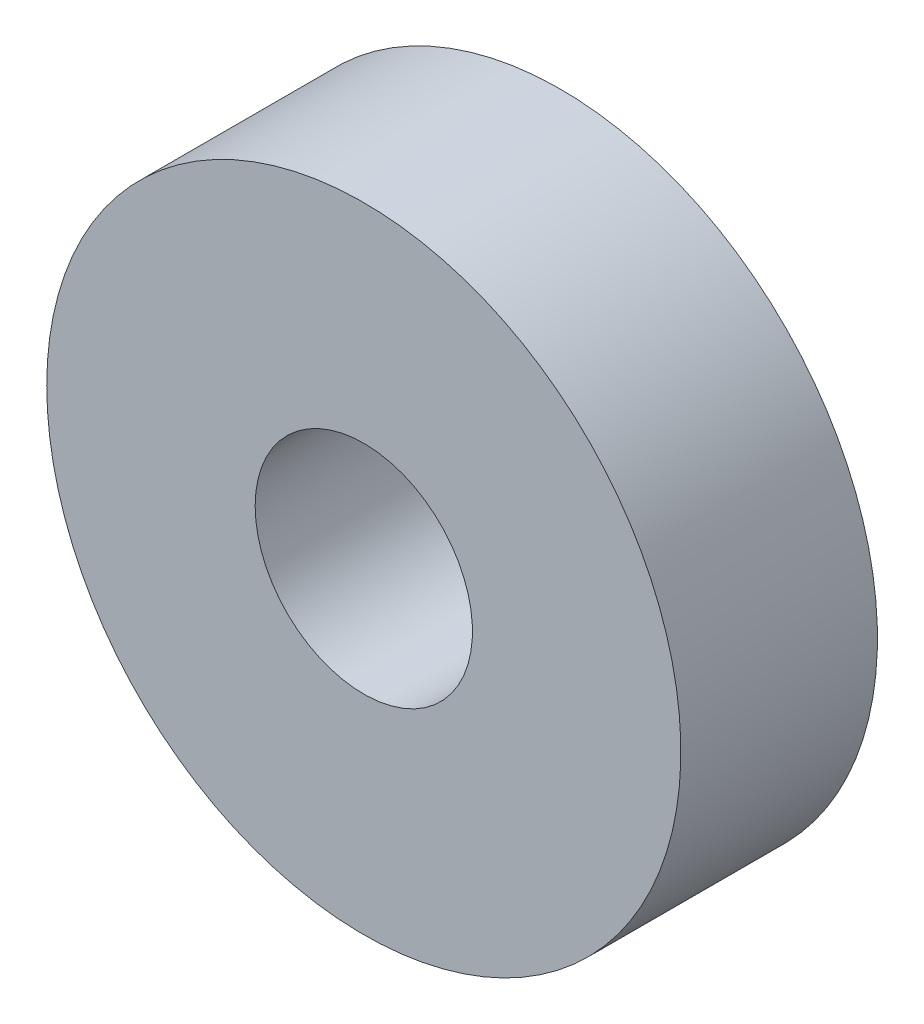
ISO-10303-21;
HEADER;
FILE_DESCRIPTION(('STEP AP214'),'2;1');
FILE_NAME('part.step','',(''),(''),'','','');
FILE_SCHEMA(('AUTOMOTIVE_DESIGN { 1 0 10303 214 1 1 1 1 }'));
ENDSEC;
DATA;
#1=APPLICATION_CONTEXT('core data for automotive mechanical design processes');
#2=APPLICATION_PROTOCOL_DEFINITION('international standard','automotive_design',2000,#1);
#3=PRODUCT_CONTEXT('',#1,'mechanical');
#4=PRODUCT('Part','Part','',(#3));
#5=PRODUCT_RELATED_PRODUCT_CATEGORY('part','',(#4));
#6=PRODUCT_DEFINITION_FORMATION('','',#4);
#7=PRODUCT_DEFINITION_CONTEXT('part definition',#1,'design');
#8=PRODUCT_DEFINITION('design','',#6,#7);
#9=PRODUCT_DEFINITION_SHAPE('','',#8);
#10=(LENGTH_UNIT() NAMED_UNIT(*) SI_UNIT(.MILLI.,.METRE.));
#11=(NAMED_UNIT(*) PLANE_ANGLE_UNIT() SI_UNIT($,.RADIAN.));
#12=(NAMED_UNIT(*) SI_UNIT($,.STERADIAN.) SOLID_ANGLE_UNIT());
#13=UNCERTAINTY_MEASURE_WITH_UNIT(LENGTH_MEASURE(1.E-05),#10,'distance_accuracy_value','');
#14=(GEOMETRIC_REPRESENTATION_CONTEXT(3) GLOBAL_UNCERTAINTY_ASSIGNED_CONTEXT((#13)) GLOBAL_UNIT_ASSIGNED_CONTEXT((#10,
#11,#12)) REPRESENTATION_CONTEXT('',''));
#15=CARTESIAN_POINT('',(0.,0.,0.));
#16=DIRECTION('',(0.,0.,1.));
#17=DIRECTION('',(1.,0.,0.));
#18=AXIS2_PLACEMENT_3D('',#15,#16,#17);
#19=CARTESIAN_POINT('',(0.,0.,-21.7308816762368));
#20=DIRECTION('',(0.,0.,-1.));
#21=DIRECTION('',(-1.,0.,0.));
#22=AXIS2_PLACEMENT_3D('',#19,#20,#21);
#23=CYLINDRICAL_SURFACE('',#22,9.525);
#24=CARTESIAN_POINT('',(0.,0.,2.95275));
#25=DIRECTION('',(0.,0.,-1.));
#26=DIRECTION('',(-1.,0.,0.));
#27=AXIS2_PLACEMENT_3D('',#24,#25,#26);
#28=CIRCLE('',#27,9.525);
#29=CARTESIAN_POINT('',(-9.525,0.,2.95275));
#30=VERTEX_POINT('',#29);
#31=EDGE_CURVE('E46',#30,#30,#28,.T.);
#32=ORIENTED_EDGE('',*,*,#31,.T.);
#33=EDGE_LOOP('',(#32));
#34=FACE_BOUND('',#33,.T.);
#35=CARTESIAN_POINT('',(0.,0.,-2.95275));
#36=DIRECTION('',(0.,0.,-1.));
#37=DIRECTION('',(-1.,0.,0.));
#38=AXIS2_PLACEMENT_3D('',#35,#36,#37);
#39=CIRCLE('',#38,9.525);
#40=CARTESIAN_POINT('',(-9.525,0.,-2.95275));
#41=VERTEX_POINT('',#40);
#42=EDGE_CURVE('E10',#41,#41,#39,.T.);
#43=ORIENTED_EDGE('',*,*,#42,.F.);
#44=EDGE_LOOP('',(#43));
#45=FACE_BOUND('',#44,.T.);
#46=ADVANCED_FACE('F32',(#34,#45),#23,.T.);
#47=CARTESIAN_POINT('',(0.,9.525,-2.95275));
#48=DIRECTION('',(0.,0.,-1.));
#49=DIRECTION('',(-1.,0.,0.));
#50=AXIS2_PLACEMENT_3D('',#47,#48,#49);
#51=PLANE('',#50);
#52=ORIENTED_EDGE('',*,*,#42,.T.);
#53=EDGE_LOOP('',(#52));
#54=FACE_BOUND('',#53,.T.);
#55=CARTESIAN_POINT('',(0.,0.,-2.95275));
#56=DIRECTION('',(0.,0.,-1.));
#57=DIRECTION('',(-1.,0.,0.));
#58=AXIS2_PLACEMENT_3D('',#55,#56,#57);
#59=CIRCLE('',#58,3.2639);
#60=CARTESIAN_POINT('',(-3.2639,0.,-2.95275));
#61=VERTEX_POINT('',#60);
#62=EDGE_CURVE('E38',#61,#61,#59,.T.);
#63=ORIENTED_EDGE('',*,*,#62,.F.);
#64=EDGE_LOOP('',(#63));
#65=FACE_BOUND('',#64,.T.);
#66=ADVANCED_FACE('F62',(#54,#65),#51,.T.);
#67=CARTESIAN_POINT('',(0.,0.,-21.7308816762368));
#68=DIRECTION('',(0.,0.,-1.));
#69=DIRECTION('',(-1.,0.,0.));
#70=AXIS2_PLACEMENT_3D('',#67,#68,#69);
#71=CYLINDRICAL_SURFACE('',#70,3.2639);
#72=ORIENTED_EDGE('',*,*,#62,.T.);
#73=EDGE_LOOP('',(#72));
#74=FACE_BOUND('',#73,.T.);
#75=CARTESIAN_POINT('',(0.,0.,2.95275));
#76=DIRECTION('',(0.,0.,-1.));
#77=DIRECTION('',(-1.,0.,0.));
#78=AXIS2_PLACEMENT_3D('',#75,#76,#77);
#79=CIRCLE('',#78,3.2639);
#80=CARTESIAN_POINT('',(-3.2639,0.,2.95275));
#81=VERTEX_POINT('',#80);
#82=EDGE_CURVE('E42',#81,#81,#79,.T.);
#83=ORIENTED_EDGE('',*,*,#82,.F.);
#84=EDGE_LOOP('',(#83));
#85=FACE_BOUND('',#84,.T.);
#86=ADVANCED_FACE('F56',(#74,#85),#71,.F.);
#87=CARTESIAN_POINT('',(0.,9.525,2.95275));
#88=DIRECTION('',(0.,0.,1.));
#89=DIRECTION('',(1.,0.,0.));
#90=AXIS2_PLACEMENT_3D('',#87,#88,#89);
#91=PLANE('',#90);
#92=ORIENTED_EDGE('',*,*,#82,.T.);
#93=EDGE_LOOP('',(#92));
#94=FACE_BOUND('',#93,.T.);
#95=ORIENTED_EDGE('',*,*,#31,.F.);
#96=EDGE_LOOP('',(#95));
#97=FACE_BOUND('',#96,.T.);
#98=ADVANCED_FACE('F54',(#94,#97),#91,.T.);
#99=CLOSED_SHELL('',(#46,#66,#86,#98));
#100=MANIFOLD_SOLID_BREP('B2',#99);
#101=ADVANCED_BREP_SHAPE_REPRESENTATION('',(#18,#100),#14);
#102=SHAPE_DEFINITION_REPRESENTATION(#9,#101);
ENDSEC;
END-ISO-10303-21;
